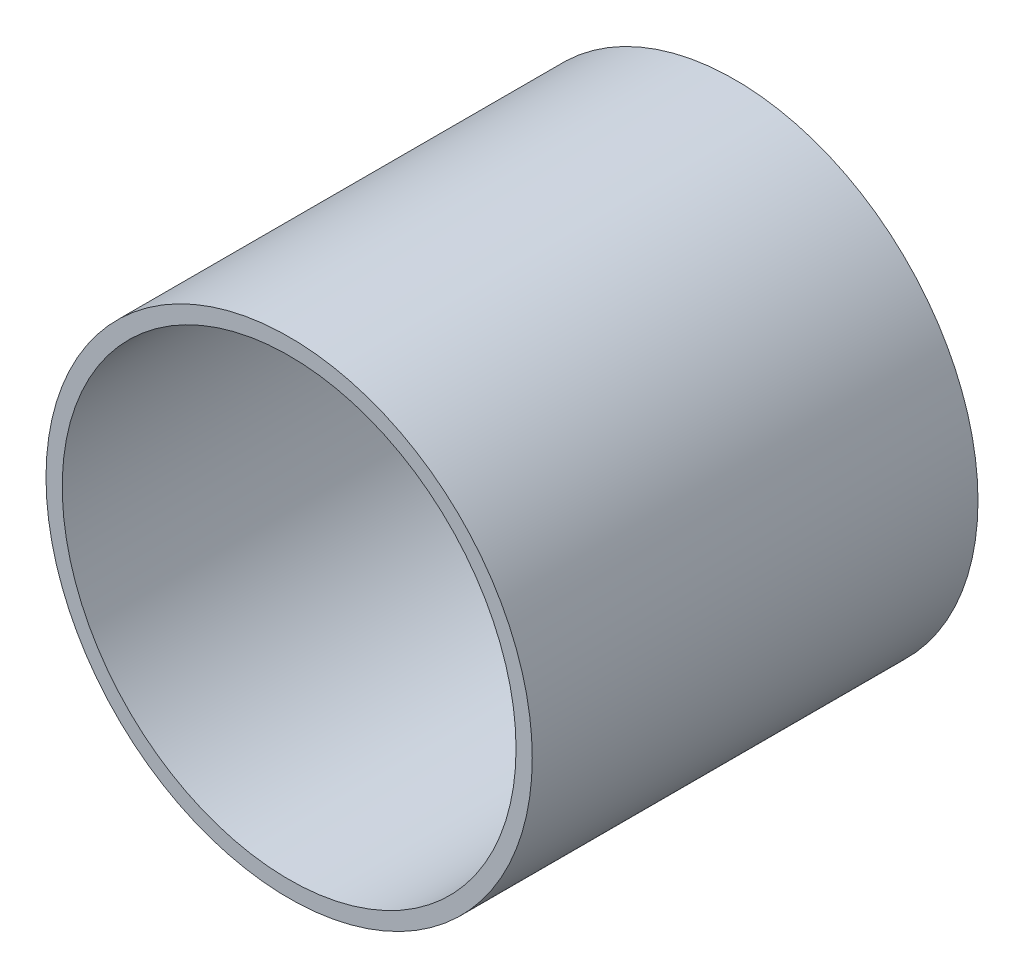
ISO-10303-21;
HEADER;
FILE_DESCRIPTION(('STEP AP214'),'2;1');
FILE_NAME('part.step','',(''),(''),'','','');
FILE_SCHEMA(('AUTOMOTIVE_DESIGN { 1 0 10303 214 1 1 1 1 }'));
ENDSEC;
DATA;
#1=APPLICATION_CONTEXT('core data for automotive mechanical design processes');
#2=APPLICATION_PROTOCOL_DEFINITION('international standard','automotive_design',2000,#1);
#3=PRODUCT_CONTEXT('',#1,'mechanical');
#4=PRODUCT('Part','Part','',(#3));
#5=PRODUCT_RELATED_PRODUCT_CATEGORY('part','',(#4));
#6=PRODUCT_DEFINITION_FORMATION('','',#4);
#7=PRODUCT_DEFINITION_CONTEXT('part definition',#1,'design');
#8=PRODUCT_DEFINITION('design','',#6,#7);
#9=PRODUCT_DEFINITION_SHAPE('','',#8);
#10=(LENGTH_UNIT() NAMED_UNIT(*) SI_UNIT(.MILLI.,.METRE.));
#11=(NAMED_UNIT(*) PLANE_ANGLE_UNIT() SI_UNIT($,.RADIAN.));
#12=(NAMED_UNIT(*) SI_UNIT($,.STERADIAN.) SOLID_ANGLE_UNIT());
#13=UNCERTAINTY_MEASURE_WITH_UNIT(LENGTH_MEASURE(1.E-05),#10,'distance_accuracy_value','');
#14=(GEOMETRIC_REPRESENTATION_CONTEXT(3) GLOBAL_UNCERTAINTY_ASSIGNED_CONTEXT((#13)) GLOBAL_UNIT_ASSIGNED_CONTEXT((#10,
#11,#12)) REPRESENTATION_CONTEXT('',''));
#15=CARTESIAN_POINT('',(0.,0.,0.));
#16=DIRECTION('',(0.,0.,1.));
#17=DIRECTION('',(1.,0.,0.));
#18=AXIS2_PLACEMENT_3D('',#15,#16,#17);
#19=CARTESIAN_POINT('',(0.,0.,5.5));
#20=DIRECTION('',(0.,0.,1.));
#21=DIRECTION('',(1.,0.,0.));
#22=AXIS2_PLACEMENT_3D('',#19,#20,#21);
#23=PLANE('',#22);
#24=CARTESIAN_POINT('',(0.,0.,5.5));
#25=DIRECTION('',(0.,0.,1.));
#26=DIRECTION('',(1.,0.,0.));
#27=AXIS2_PLACEMENT_3D('',#24,#25,#26);
#28=CIRCLE('',#27,3.);
#29=CARTESIAN_POINT('',(3.,0.,5.5));
#30=VERTEX_POINT('',#29);
#31=EDGE_CURVE('E10',#30,#30,#28,.T.);
#32=ORIENTED_EDGE('',*,*,#31,.T.);
#33=EDGE_LOOP('',(#32));
#34=FACE_BOUND('',#33,.T.);
#35=CARTESIAN_POINT('',(0.,0.,5.5));
#36=DIRECTION('',(0.,0.,1.));
#37=DIRECTION('',(1.,0.,0.));
#38=AXIS2_PLACEMENT_3D('',#35,#36,#37);
#39=CIRCLE('',#38,2.8);
#40=CARTESIAN_POINT('',(2.8,0.,5.5));
#41=VERTEX_POINT('',#40);
#42=EDGE_CURVE('E41',#41,#41,#39,.T.);
#43=ORIENTED_EDGE('',*,*,#42,.F.);
#44=EDGE_LOOP('',(#43));
#45=FACE_BOUND('',#44,.T.);
#46=ADVANCED_FACE('F30',(#34,#45),#23,.T.);
#47=CARTESIAN_POINT('',(0.,0.,0.));
#48=DIRECTION('',(0.,0.,1.));
#49=DIRECTION('',(1.,0.,0.));
#50=AXIS2_PLACEMENT_3D('',#47,#48,#49);
#51=PLANE('',#50);
#52=CARTESIAN_POINT('',(0.,0.,0.));
#53=DIRECTION('',(0.,0.,1.));
#54=DIRECTION('',(1.,0.,0.));
#55=AXIS2_PLACEMENT_3D('',#52,#53,#54);
#56=CIRCLE('',#55,3.);
#57=CARTESIAN_POINT('',(3.,0.,0.));
#58=VERTEX_POINT('',#57);
#59=EDGE_CURVE('E34',#58,#58,#56,.T.);
#60=ORIENTED_EDGE('',*,*,#59,.F.);
#61=EDGE_LOOP('',(#60));
#62=FACE_BOUND('',#61,.T.);
#63=CARTESIAN_POINT('',(0.,0.,0.));
#64=DIRECTION('',(0.,0.,1.));
#65=DIRECTION('',(1.,0.,0.));
#66=AXIS2_PLACEMENT_3D('',#63,#64,#65);
#67=CIRCLE('',#66,2.8);
#68=CARTESIAN_POINT('',(2.8,0.,0.));
#69=VERTEX_POINT('',#68);
#70=EDGE_CURVE('E43',#69,#69,#67,.T.);
#71=ORIENTED_EDGE('',*,*,#70,.T.);
#72=EDGE_LOOP('',(#71));
#73=FACE_BOUND('',#72,.T.);
#74=ADVANCED_FACE('F53',(#62,#73),#51,.F.);
#75=CARTESIAN_POINT('',(0.,0.,5.5));
#76=DIRECTION('',(0.,0.,-1.));
#77=DIRECTION('',(-1.,0.,0.));
#78=AXIS2_PLACEMENT_3D('',#75,#76,#77);
#79=CYLINDRICAL_SURFACE('',#78,3.);
#80=ORIENTED_EDGE('',*,*,#31,.F.);
#81=EDGE_LOOP('',(#80));
#82=FACE_BOUND('',#81,.T.);
#83=ORIENTED_EDGE('',*,*,#59,.T.);
#84=EDGE_LOOP('',(#83));
#85=FACE_BOUND('',#84,.T.);
#86=ADVANCED_FACE('F32',(#82,#85),#79,.T.);
#87=CARTESIAN_POINT('',(0.,0.,5.5));
#88=DIRECTION('',(0.,0.,-1.));
#89=DIRECTION('',(-1.,0.,0.));
#90=AXIS2_PLACEMENT_3D('',#87,#88,#89);
#91=CYLINDRICAL_SURFACE('',#90,2.8);
#92=ORIENTED_EDGE('',*,*,#42,.T.);
#93=EDGE_LOOP('',(#92));
#94=FACE_BOUND('',#93,.T.);
#95=ORIENTED_EDGE('',*,*,#70,.F.);
#96=EDGE_LOOP('',(#95));
#97=FACE_BOUND('',#96,.T.);
#98=ADVANCED_FACE('F49',(#94,#97),#91,.F.);
#99=CLOSED_SHELL('',(#46,#74,#86,#98));
#100=MANIFOLD_SOLID_BREP('B2',#99);
#101=ADVANCED_BREP_SHAPE_REPRESENTATION('',(#18,#100),#14);
#102=SHAPE_DEFINITION_REPRESENTATION(#9,#101);
ENDSEC;
END-ISO-10303-21;
